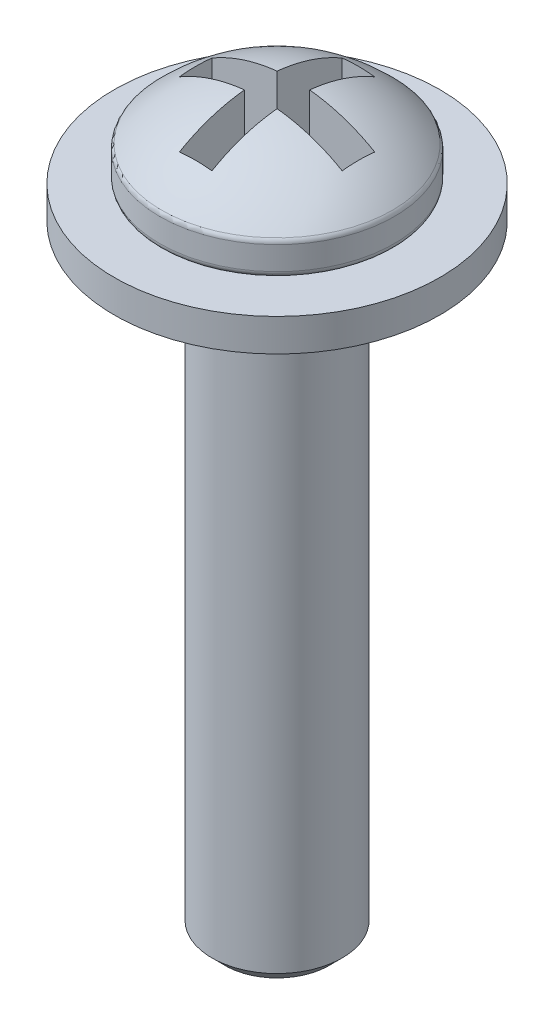
ISO-10303-21;
HEADER;
FILE_DESCRIPTION(('STEP AP214'),'2;1');
FILE_NAME('part.step','',(''),(''),'','','');
FILE_SCHEMA(('AUTOMOTIVE_DESIGN { 1 0 10303 214 1 1 1 1 }'));
ENDSEC;
DATA;
#1=APPLICATION_CONTEXT('core data for automotive mechanical design processes');
#2=APPLICATION_PROTOCOL_DEFINITION('international standard','automotive_design',2000,#1);
#3=PRODUCT_CONTEXT('',#1,'mechanical');
#4=PRODUCT('Part','Part','',(#3));
#5=PRODUCT_RELATED_PRODUCT_CATEGORY('part','',(#4));
#6=PRODUCT_DEFINITION_FORMATION('','',#4);
#7=PRODUCT_DEFINITION_CONTEXT('part definition',#1,'design');
#8=PRODUCT_DEFINITION('design','',#6,#7);
#9=PRODUCT_DEFINITION_SHAPE('','',#8);
#10=(LENGTH_UNIT() NAMED_UNIT(*) SI_UNIT(.MILLI.,.METRE.));
#11=(NAMED_UNIT(*) PLANE_ANGLE_UNIT() SI_UNIT($,.RADIAN.));
#12=(NAMED_UNIT(*) SI_UNIT($,.STERADIAN.) SOLID_ANGLE_UNIT());
#13=UNCERTAINTY_MEASURE_WITH_UNIT(LENGTH_MEASURE(1.E-05),#10,'distance_accuracy_value','');
#14=(GEOMETRIC_REPRESENTATION_CONTEXT(3) GLOBAL_UNCERTAINTY_ASSIGNED_CONTEXT((#13)) GLOBAL_UNIT_ASSIGNED_CONTEXT((#10,
#11,#12)) REPRESENTATION_CONTEXT('',''));
#15=CARTESIAN_POINT('',(0.,0.,0.));
#16=DIRECTION('',(0.,0.,1.));
#17=DIRECTION('',(1.,0.,0.));
#18=AXIS2_PLACEMENT_3D('',#15,#16,#17);
#19=CARTESIAN_POINT('',(0.,-1.2188961038961,0.));
#20=DIRECTION('',(0.,-1.,0.));
#21=DIRECTION('',(1.,0.,0.));
#22=AXIS2_PLACEMENT_3D('',#19,#20,#21);
#23=SPHERICAL_SURFACE('',#22,2.4888961038961);
#24=CARTESIAN_POINT('',(0.,0.529699603001643,0.));
#25=DIRECTION('',(0.,-1.,0.));
#26=DIRECTION('',(0.,0.,-1.));
#27=AXIS2_PLACEMENT_3D('',#24,#25,#26);
#28=CIRCLE('',#27,1.77116257576993);
#29=CARTESIAN_POINT('',(0.,0.529699603001643,-1.77116257576993));
#30=VERTEX_POINT('',#29);
#31=EDGE_CURVE('E187',#30,#30,#28,.F.);
#32=ORIENTED_EDGE('',*,*,#31,.T.);
#33=EDGE_LOOP('',(#32));
#34=FACE_BOUND('',#33,.T.);
#35=CARTESIAN_POINT('',(0.25,-1.2188961038961,0.));
#36=DIRECTION('',(-1.,0.,0.));
#37=DIRECTION('',(0.,0.,1.));
#38=AXIS2_PLACEMENT_3D('',#35,#36,#37);
#39=CIRCLE('',#38,2.47630850581853);
#40=CARTESIAN_POINT('',(0.25,1.24476049067815,-0.25));
#41=VERTEX_POINT('',#40);
#42=CARTESIAN_POINT('',(0.25,0.918767063206985,-1.25));
#43=VERTEX_POINT('',#42);
#44=EDGE_CURVE('E113',#41,#43,#39,.T.);
#45=ORIENTED_EDGE('',*,*,#44,.F.);
#46=CARTESIAN_POINT('',(0.,-1.2188961038961,-0.25));
#47=DIRECTION('',(0.,0.,-1.));
#48=DIRECTION('',(-1.,0.,0.));
#49=AXIS2_PLACEMENT_3D('',#46,#47,#48);
#50=CIRCLE('',#49,2.47630850581853);
#51=CARTESIAN_POINT('',(1.25,0.918767063206984,-0.25));
#52=VERTEX_POINT('',#51);
#53=EDGE_CURVE('E192',#41,#52,#50,.T.);
#54=ORIENTED_EDGE('',*,*,#53,.T.);
#55=CARTESIAN_POINT('',(1.25,-1.2188961038961,0.));
#56=DIRECTION('',(1.,0.,0.));
#57=DIRECTION('',(0.,0.,-1.));
#58=AXIS2_PLACEMENT_3D('',#55,#56,#57);
#59=CIRCLE('',#58,2.15223228671749);
#60=CARTESIAN_POINT('',(1.25,0.918767063206985,0.25));
#61=VERTEX_POINT('',#60);
#62=EDGE_CURVE('E193',#52,#61,#59,.T.);
#63=ORIENTED_EDGE('',*,*,#62,.T.);
#64=CARTESIAN_POINT('',(0.,-1.2188961038961,0.25));
#65=DIRECTION('',(0.,0.,1.));
#66=DIRECTION('',(1.,0.,0.));
#67=AXIS2_PLACEMENT_3D('',#64,#65,#66);
#68=CIRCLE('',#67,2.47630850581853);
#69=CARTESIAN_POINT('',(0.25,1.24476049067815,0.25));
#70=VERTEX_POINT('',#69);
#71=EDGE_CURVE('E200',#61,#70,#68,.T.);
#72=ORIENTED_EDGE('',*,*,#71,.T.);
#73=CARTESIAN_POINT('',(0.25,0.918767063206985,1.25));
#74=VERTEX_POINT('',#73);
#75=EDGE_CURVE('E152',#74,#70,#39,.T.);
#76=ORIENTED_EDGE('',*,*,#75,.F.);
#77=CARTESIAN_POINT('',(0.,-1.2188961038961,1.25));
#78=DIRECTION('',(0.,0.,-1.));
#79=DIRECTION('',(-1.,0.,0.));
#80=AXIS2_PLACEMENT_3D('',#77,#78,#79);
#81=CIRCLE('',#80,2.15223228671749);
#82=CARTESIAN_POINT('',(-0.25,0.918767063206985,1.25));
#83=VERTEX_POINT('',#82);
#84=EDGE_CURVE('E202',#83,#74,#81,.T.);
#85=ORIENTED_EDGE('',*,*,#84,.F.);
#86=CARTESIAN_POINT('',(-0.25,-1.2188961038961,0.));
#87=DIRECTION('',(1.,0.,0.));
#88=DIRECTION('',(0.,0.,-1.));
#89=AXIS2_PLACEMENT_3D('',#86,#87,#88);
#90=CIRCLE('',#89,2.47630850581853);
#91=CARTESIAN_POINT('',(-0.25,1.24476049067815,0.25));
#92=VERTEX_POINT('',#91);
#93=EDGE_CURVE('E146',#92,#83,#90,.T.);
#94=ORIENTED_EDGE('',*,*,#93,.F.);
#95=CARTESIAN_POINT('',(-1.25,0.918767063206985,0.25));
#96=VERTEX_POINT('',#95);
#97=EDGE_CURVE('E196',#92,#96,#68,.T.);
#98=ORIENTED_EDGE('',*,*,#97,.T.);
#99=CARTESIAN_POINT('',(-1.25,-1.2188961038961,0.));
#100=DIRECTION('',(-1.,0.,0.));
#101=DIRECTION('',(0.,0.,1.));
#102=AXIS2_PLACEMENT_3D('',#99,#100,#101);
#103=CIRCLE('',#102,2.15223228671749);
#104=CARTESIAN_POINT('',(-1.25,0.918767063206985,-0.25));
#105=VERTEX_POINT('',#104);
#106=EDGE_CURVE('E205',#96,#105,#103,.T.);
#107=ORIENTED_EDGE('',*,*,#106,.T.);
#108=CARTESIAN_POINT('',(-0.25,1.24476049067815,-0.25));
#109=VERTEX_POINT('',#108);
#110=EDGE_CURVE('E195',#105,#109,#50,.T.);
#111=ORIENTED_EDGE('',*,*,#110,.T.);
#112=CARTESIAN_POINT('',(-0.25,0.918767063206985,-1.25));
#113=VERTEX_POINT('',#112);
#114=EDGE_CURVE('E144',#113,#109,#90,.T.);
#115=ORIENTED_EDGE('',*,*,#114,.F.);
#116=CARTESIAN_POINT('',(0.,-1.2188961038961,-1.25));
#117=DIRECTION('',(0.,0.,1.));
#118=DIRECTION('',(1.,0.,0.));
#119=AXIS2_PLACEMENT_3D('',#116,#117,#118);
#120=CIRCLE('',#119,2.15223228671749);
#121=EDGE_CURVE('E210',#43,#113,#120,.T.);
#122=ORIENTED_EDGE('',*,*,#121,.F.);
#123=EDGE_LOOP('',(#45,#54,#63,#72,#76,#85,#94,#98,#107,#111,#115,#122));
#124=FACE_BOUND('',#123,.T.);
#125=ADVANCED_FACE('F17',(#34,#124),#23,.T.);
#126=CARTESIAN_POINT('',(1.25,5.1,0.25));
#127=DIRECTION('',(0.,0.,1.));
#128=DIRECTION('',(1.,0.,0.));
#129=AXIS2_PLACEMENT_3D('',#126,#127,#128);
#130=PLANE('',#129);
#131=DIRECTION('',(0.,-1.,0.));
#132=VECTOR('',#131,1.);
#133=CARTESIAN_POINT('',(0.25,5.1,0.25));
#134=LINE('',#133,#132);
#135=CARTESIAN_POINT('',(0.25,0.1,0.25));
#136=VERTEX_POINT('',#135);
#137=EDGE_CURVE('E153',#70,#136,#134,.T.);
#138=ORIENTED_EDGE('',*,*,#137,.F.);
#139=ORIENTED_EDGE('',*,*,#71,.F.);
#140=DIRECTION('',(0.,-1.,0.));
#141=VECTOR('',#140,1.);
#142=CARTESIAN_POINT('',(1.25,5.1,0.25));
#143=LINE('',#142,#141);
#144=CARTESIAN_POINT('',(1.25,0.1,0.25));
#145=VERTEX_POINT('',#144);
#146=EDGE_CURVE('E173',#61,#145,#143,.T.);
#147=ORIENTED_EDGE('',*,*,#146,.T.);
#148=DIRECTION('',(-1.,0.,0.));
#149=VECTOR('',#148,1.);
#150=CARTESIAN_POINT('',(1.25,0.1,0.25));
#151=LINE('',#150,#149);
#152=EDGE_CURVE('E167',#145,#136,#151,.T.);
#153=ORIENTED_EDGE('',*,*,#152,.T.);
#154=EDGE_LOOP('',(#138,#139,#147,#153));
#155=FACE_BOUND('',#154,.T.);
#156=ADVANCED_FACE('F228',(#155),#130,.F.);
#157=DIRECTION('',(0.,1.,0.));
#158=VECTOR('',#157,1.);
#159=CARTESIAN_POINT('',(-0.25,5.1,0.25));
#160=LINE('',#159,#158);
#161=CARTESIAN_POINT('',(-0.25,0.1,0.25));
#162=VERTEX_POINT('',#161);
#163=EDGE_CURVE('E150',#162,#92,#160,.T.);
#164=ORIENTED_EDGE('',*,*,#163,.F.);
#165=CARTESIAN_POINT('',(-1.25,0.1,0.25));
#166=VERTEX_POINT('',#165);
#167=EDGE_CURVE('E164',#162,#166,#151,.T.);
#168=ORIENTED_EDGE('',*,*,#167,.T.);
#169=DIRECTION('',(0.,-1.,0.));
#170=VECTOR('',#169,1.);
#171=CARTESIAN_POINT('',(-1.25,5.1,0.25));
#172=LINE('',#171,#170);
#173=EDGE_CURVE('E168',#96,#166,#172,.T.);
#174=ORIENTED_EDGE('',*,*,#173,.F.);
#175=ORIENTED_EDGE('',*,*,#97,.F.);
#176=EDGE_LOOP('',(#164,#168,#174,#175));
#177=FACE_BOUND('',#176,.T.);
#178=ADVANCED_FACE('F240',(#177),#130,.F.);
#179=CARTESIAN_POINT('',(1.25,5.1,-0.25));
#180=DIRECTION('',(0.,0.,-1.));
#181=DIRECTION('',(-1.,0.,0.));
#182=AXIS2_PLACEMENT_3D('',#179,#180,#181);
#183=PLANE('',#182);
#184=DIRECTION('',(0.,1.,0.));
#185=VECTOR('',#184,1.);
#186=CARTESIAN_POINT('',(0.25,5.1,-0.25));
#187=LINE('',#186,#185);
#188=CARTESIAN_POINT('',(0.25,0.1,-0.25));
#189=VERTEX_POINT('',#188);
#190=EDGE_CURVE('E147',#189,#41,#187,.T.);
#191=ORIENTED_EDGE('',*,*,#190,.F.);
#192=DIRECTION('',(1.,0.,0.));
#193=VECTOR('',#192,1.);
#194=CARTESIAN_POINT('',(1.25,0.1,-0.25));
#195=LINE('',#194,#193);
#196=CARTESIAN_POINT('',(1.25,0.1,-0.25));
#197=VERTEX_POINT('',#196);
#198=EDGE_CURVE('E126',#189,#197,#195,.T.);
#199=ORIENTED_EDGE('',*,*,#198,.T.);
#200=DIRECTION('',(0.,-1.,0.));
#201=VECTOR('',#200,1.);
#202=CARTESIAN_POINT('',(1.25,5.1,-0.25));
#203=LINE('',#202,#201);
#204=EDGE_CURVE('E179',#52,#197,#203,.T.);
#205=ORIENTED_EDGE('',*,*,#204,.F.);
#206=ORIENTED_EDGE('',*,*,#53,.F.);
#207=EDGE_LOOP('',(#191,#199,#205,#206));
#208=FACE_BOUND('',#207,.T.);
#209=ADVANCED_FACE('F268',(#208),#183,.F.);
#210=DIRECTION('',(0.,-1.,0.));
#211=VECTOR('',#210,1.);
#212=CARTESIAN_POINT('',(-0.25,5.1,-0.25));
#213=LINE('',#212,#211);
#214=CARTESIAN_POINT('',(-0.25,0.1,-0.25));
#215=VERTEX_POINT('',#214);
#216=EDGE_CURVE('E118',#109,#215,#213,.T.);
#217=ORIENTED_EDGE('',*,*,#216,.F.);
#218=ORIENTED_EDGE('',*,*,#110,.F.);
#219=DIRECTION('',(0.,-1.,0.));
#220=VECTOR('',#219,1.);
#221=CARTESIAN_POINT('',(-1.25,5.1,-0.25));
#222=LINE('',#221,#220);
#223=CARTESIAN_POINT('',(-1.25,0.1,-0.25));
#224=VERTEX_POINT('',#223);
#225=EDGE_CURVE('E166',#105,#224,#222,.T.);
#226=ORIENTED_EDGE('',*,*,#225,.T.);
#227=EDGE_CURVE('E157',#224,#215,#195,.T.);
#228=ORIENTED_EDGE('',*,*,#227,.T.);
#229=EDGE_LOOP('',(#217,#218,#226,#228));
#230=FACE_BOUND('',#229,.T.);
#231=ADVANCED_FACE('F265',(#230),#183,.F.);
#232=CARTESIAN_POINT('',(0.,0.,0.));
#233=DIRECTION('',(0.,-1.,0.));
#234=DIRECTION('',(0.,0.,-1.));
#235=AXIS2_PLACEMENT_3D('',#232,#233,#234);
#236=CYLINDRICAL_SURFACE('',#235,1.8);
#237=CARTESIAN_POINT('',(0.,0.1,0.));
#238=DIRECTION('',(0.,1.,0.));
#239=DIRECTION('',(0.,0.,1.));
#240=AXIS2_PLACEMENT_3D('',#237,#238,#239);
#241=CIRCLE('',#240,1.8);
#242=CARTESIAN_POINT('',(0.,0.1,1.8));
#243=VERTEX_POINT('',#242);
#244=EDGE_CURVE('E184',#243,#243,#241,.T.);
#245=ORIENTED_EDGE('',*,*,#244,.T.);
#246=EDGE_LOOP('',(#245));
#247=FACE_BOUND('',#246,.T.);
#248=CARTESIAN_POINT('',(0.,0.459443729156185,0.));
#249=DIRECTION('',(0.,-1.,0.));
#250=DIRECTION('',(0.,0.,-1.));
#251=AXIS2_PLACEMENT_3D('',#248,#249,#250);
#252=CIRCLE('',#251,1.8);
#253=CARTESIAN_POINT('',(0.,0.459443729156185,-1.8));
#254=VERTEX_POINT('',#253);
#255=EDGE_CURVE('E181',#254,#254,#252,.T.);
#256=ORIENTED_EDGE('',*,*,#255,.T.);
#257=EDGE_LOOP('',(#256));
#258=FACE_BOUND('',#257,.T.);
#259=ADVANCED_FACE('F245',(#247,#258),#236,.T.);
#260=CARTESIAN_POINT('',(0.,0.1,0.));
#261=DIRECTION('',(0.,1.,0.));
#262=DIRECTION('',(0.,0.,1.));
#263=AXIS2_PLACEMENT_3D('',#260,#261,#262);
#264=TOROIDAL_SURFACE('',#263,1.7,0.1);
#265=ORIENTED_EDGE('',*,*,#244,.F.);
#266=EDGE_LOOP('',(#265));
#267=FACE_BOUND('',#266,.T.);
#268=CARTESIAN_POINT('',(0.,0.,0.));
#269=DIRECTION('',(0.,1.,0.));
#270=DIRECTION('',(0.,0.,1.));
#271=AXIS2_PLACEMENT_3D('',#268,#269,#270);
#272=CIRCLE('',#271,1.7);
#273=CARTESIAN_POINT('',(0.,0.,1.7));
#274=VERTEX_POINT('',#273);
#275=EDGE_CURVE('E174',#274,#274,#272,.F.);
#276=ORIENTED_EDGE('',*,*,#275,.F.);
#277=EDGE_LOOP('',(#276));
#278=FACE_BOUND('',#277,.T.);
#279=ADVANCED_FACE('F242',(#267,#278),#264,.T.);
#280=CARTESIAN_POINT('',(0.,0.459443729156185,0.));
#281=DIRECTION('',(0.,-1.,0.));
#282=DIRECTION('',(0.,0.,-1.));
#283=AXIS2_PLACEMENT_3D('',#280,#281,#282);
#284=TOROIDAL_SURFACE('',#283,1.7,0.1);
#285=ORIENTED_EDGE('',*,*,#31,.F.);
#286=EDGE_LOOP('',(#285));
#287=FACE_BOUND('',#286,.T.);
#288=ORIENTED_EDGE('',*,*,#255,.F.);
#289=EDGE_LOOP('',(#288));
#290=FACE_BOUND('',#289,.T.);
#291=ADVANCED_FACE('F244',(#287,#290),#284,.T.);
#292=CARTESIAN_POINT('',(-1.25,5.1,0.25));
#293=DIRECTION('',(-1.,0.,0.));
#294=DIRECTION('',(0.,0.,1.));
#295=AXIS2_PLACEMENT_3D('',#292,#293,#294);
#296=PLANE('',#295);
#297=ORIENTED_EDGE('',*,*,#173,.T.);
#298=DIRECTION('',(0.,0.,-1.));
#299=VECTOR('',#298,1.);
#300=CARTESIAN_POINT('',(-1.25,0.1,0.25));
#301=LINE('',#300,#299);
#302=EDGE_CURVE('E156',#166,#224,#301,.T.);
#303=ORIENTED_EDGE('',*,*,#302,.T.);
#304=ORIENTED_EDGE('',*,*,#225,.F.);
#305=ORIENTED_EDGE('',*,*,#106,.F.);
#306=EDGE_LOOP('',(#297,#303,#304,#305));
#307=FACE_BOUND('',#306,.T.);
#308=ADVANCED_FACE('F249',(#307),#296,.F.);
#309=CARTESIAN_POINT('',(1.25,5.1,0.25));
#310=DIRECTION('',(1.,0.,0.));
#311=DIRECTION('',(0.,0.,-1.));
#312=AXIS2_PLACEMENT_3D('',#309,#310,#311);
#313=PLANE('',#312);
#314=ORIENTED_EDGE('',*,*,#204,.T.);
#315=DIRECTION('',(0.,0.,1.));
#316=VECTOR('',#315,1.);
#317=CARTESIAN_POINT('',(1.25,0.1,0.25));
#318=LINE('',#317,#316);
#319=EDGE_CURVE('E165',#197,#145,#318,.T.);
#320=ORIENTED_EDGE('',*,*,#319,.T.);
#321=ORIENTED_EDGE('',*,*,#146,.F.);
#322=ORIENTED_EDGE('',*,*,#62,.F.);
#323=EDGE_LOOP('',(#314,#320,#321,#322));
#324=FACE_BOUND('',#323,.T.);
#325=ADVANCED_FACE('F255',(#324),#313,.F.);
#326=CARTESIAN_POINT('',(0.,0.1,0.));
#327=DIRECTION('',(0.,1.,0.));
#328=DIRECTION('',(0.,0.,1.));
#329=AXIS2_PLACEMENT_3D('',#326,#327,#328);
#330=PLANE('',#329);
#331=ORIENTED_EDGE('',*,*,#167,.F.);
#332=DIRECTION('',(0.,0.,1.));
#333=VECTOR('',#332,1.);
#334=CARTESIAN_POINT('',(-0.25,0.1,1.25));
#335=LINE('',#334,#333);
#336=CARTESIAN_POINT('',(-0.25,0.1,1.25));
#337=VERTEX_POINT('',#336);
#338=EDGE_CURVE('E131',#162,#337,#335,.T.);
#339=ORIENTED_EDGE('',*,*,#338,.T.);
#340=DIRECTION('',(1.,0.,0.));
#341=VECTOR('',#340,1.);
#342=CARTESIAN_POINT('',(-0.25,0.1,1.25));
#343=LINE('',#342,#341);
#344=CARTESIAN_POINT('',(0.25,0.1,1.25));
#345=VERTEX_POINT('',#344);
#346=EDGE_CURVE('E140',#337,#345,#343,.T.);
#347=ORIENTED_EDGE('',*,*,#346,.T.);
#348=DIRECTION('',(0.,0.,-1.));
#349=VECTOR('',#348,1.);
#350=CARTESIAN_POINT('',(0.25,0.1,1.25));
#351=LINE('',#350,#349);
#352=EDGE_CURVE('E37',#345,#136,#351,.T.);
#353=ORIENTED_EDGE('',*,*,#352,.T.);
#354=ORIENTED_EDGE('',*,*,#152,.F.);
#355=ORIENTED_EDGE('',*,*,#319,.F.);
#356=ORIENTED_EDGE('',*,*,#198,.F.);
#357=CARTESIAN_POINT('',(0.25,0.1,-1.25));
#358=VERTEX_POINT('',#357);
#359=EDGE_CURVE('E115',#189,#358,#351,.T.);
#360=ORIENTED_EDGE('',*,*,#359,.T.);
#361=DIRECTION('',(-1.,0.,0.));
#362=VECTOR('',#361,1.);
#363=CARTESIAN_POINT('',(-0.25,0.1,-1.25));
#364=LINE('',#363,#362);
#365=CARTESIAN_POINT('',(-0.25,0.1,-1.25));
#366=VERTEX_POINT('',#365);
#367=EDGE_CURVE('E122',#358,#366,#364,.T.);
#368=ORIENTED_EDGE('',*,*,#367,.T.);
#369=EDGE_CURVE('E31',#366,#215,#335,.T.);
#370=ORIENTED_EDGE('',*,*,#369,.T.);
#371=ORIENTED_EDGE('',*,*,#227,.F.);
#372=ORIENTED_EDGE('',*,*,#302,.F.);
#373=EDGE_LOOP('',(#331,#339,#347,#353,#354,#355,#356,#360,#368,#370,#371,#372));
#374=FACE_BOUND('',#373,.T.);
#375=ADVANCED_FACE('F123',(#374),#330,.T.);
#376=CARTESIAN_POINT('',(-0.25,1.25741240192243,1.25));
#377=DIRECTION('',(1.,0.,0.));
#378=DIRECTION('',(0.,0.,-1.));
#379=AXIS2_PLACEMENT_3D('',#376,#377,#378);
#380=PLANE('',#379);
#381=ORIENTED_EDGE('',*,*,#114,.T.);
#382=ORIENTED_EDGE('',*,*,#216,.T.);
#383=ORIENTED_EDGE('',*,*,#369,.F.);
#384=DIRECTION('',(0.,-1.,0.));
#385=VECTOR('',#384,1.);
#386=CARTESIAN_POINT('',(-0.25,1.25741240192243,-1.25));
#387=LINE('',#386,#385);
#388=EDGE_CURVE('E120',#113,#366,#387,.T.);
#389=ORIENTED_EDGE('',*,*,#388,.F.);
#390=EDGE_LOOP('',(#381,#382,#383,#389));
#391=FACE_BOUND('',#390,.T.);
#392=ADVANCED_FACE('F313',(#391),#380,.T.);
#393=CARTESIAN_POINT('',(0.25,1.25741240192243,1.25));
#394=DIRECTION('',(-1.,0.,0.));
#395=DIRECTION('',(0.,0.,1.));
#396=AXIS2_PLACEMENT_3D('',#393,#394,#395);
#397=PLANE('',#396);
#398=ORIENTED_EDGE('',*,*,#44,.T.);
#399=DIRECTION('',(0.,-1.,0.));
#400=VECTOR('',#399,1.);
#401=CARTESIAN_POINT('',(0.25,1.25741240192243,-1.25));
#402=LINE('',#401,#400);
#403=EDGE_CURVE('E108',#43,#358,#402,.T.);
#404=ORIENTED_EDGE('',*,*,#403,.T.);
#405=ORIENTED_EDGE('',*,*,#359,.F.);
#406=ORIENTED_EDGE('',*,*,#190,.T.);
#407=EDGE_LOOP('',(#398,#404,#405,#406));
#408=FACE_BOUND('',#407,.T.);
#409=ADVANCED_FACE('F112',(#408),#397,.T.);
#410=CARTESIAN_POINT('',(-0.25,1.25741240192243,-1.25));
#411=DIRECTION('',(0.,0.,1.));
#412=DIRECTION('',(1.,0.,0.));
#413=AXIS2_PLACEMENT_3D('',#410,#411,#412);
#414=PLANE('',#413);
#415=ORIENTED_EDGE('',*,*,#121,.T.);
#416=ORIENTED_EDGE('',*,*,#388,.T.);
#417=ORIENTED_EDGE('',*,*,#367,.F.);
#418=ORIENTED_EDGE('',*,*,#403,.F.);
#419=EDGE_LOOP('',(#415,#416,#417,#418));
#420=FACE_BOUND('',#419,.T.);
#421=ADVANCED_FACE('F127',(#420),#414,.T.);
#422=CARTESIAN_POINT('',(-0.25,1.25741240192243,1.25));
#423=DIRECTION('',(0.,0.,-1.));
#424=DIRECTION('',(-1.,0.,0.));
#425=AXIS2_PLACEMENT_3D('',#422,#423,#424);
#426=PLANE('',#425);
#427=ORIENTED_EDGE('',*,*,#84,.T.);
#428=DIRECTION('',(0.,-1.,0.));
#429=VECTOR('',#428,1.);
#430=CARTESIAN_POINT('',(0.25,1.25741240192243,1.25));
#431=LINE('',#430,#429);
#432=EDGE_CURVE('E136',#74,#345,#431,.T.);
#433=ORIENTED_EDGE('',*,*,#432,.T.);
#434=ORIENTED_EDGE('',*,*,#346,.F.);
#435=DIRECTION('',(0.,-1.,0.));
#436=VECTOR('',#435,1.);
#437=CARTESIAN_POINT('',(-0.25,1.25741240192243,1.25));
#438=LINE('',#437,#436);
#439=EDGE_CURVE('E143',#83,#337,#438,.T.);
#440=ORIENTED_EDGE('',*,*,#439,.F.);
#441=EDGE_LOOP('',(#427,#433,#434,#440));
#442=FACE_BOUND('',#441,.T.);
#443=ADVANCED_FACE('F304',(#442),#426,.T.);
#444=ORIENTED_EDGE('',*,*,#75,.T.);
#445=ORIENTED_EDGE('',*,*,#137,.T.);
#446=ORIENTED_EDGE('',*,*,#352,.F.);
#447=ORIENTED_EDGE('',*,*,#432,.F.);
#448=EDGE_LOOP('',(#444,#445,#446,#447));
#449=FACE_BOUND('',#448,.T.);
#450=ADVANCED_FACE('F308',(#449),#397,.T.);
#451=ORIENTED_EDGE('',*,*,#93,.T.);
#452=ORIENTED_EDGE('',*,*,#439,.T.);
#453=ORIENTED_EDGE('',*,*,#338,.F.);
#454=ORIENTED_EDGE('',*,*,#163,.T.);
#455=EDGE_LOOP('',(#451,#452,#453,#454));
#456=FACE_BOUND('',#455,.T.);
#457=ADVANCED_FACE('F298',(#456),#380,.T.);
#458=CARTESIAN_POINT('',(0.,-0.5,0.));
#459=DIRECTION('',(0.,1.,0.));
#460=DIRECTION('',(0.,0.,1.));
#461=AXIS2_PLACEMENT_3D('',#458,#459,#460);
#462=CYLINDRICAL_SURFACE('',#461,2.5);
#463=CARTESIAN_POINT('',(0.,-0.5,0.));
#464=DIRECTION('',(0.,-1.,0.));
#465=DIRECTION('',(0.,0.,-1.));
#466=AXIS2_PLACEMENT_3D('',#463,#464,#465);
#467=CIRCLE('',#466,2.5);
#468=CARTESIAN_POINT('',(0.,-0.5,-2.5));
#469=VERTEX_POINT('',#468);
#470=EDGE_CURVE('E284',#469,#469,#467,.T.);
#471=ORIENTED_EDGE('',*,*,#470,.F.);
#472=EDGE_LOOP('',(#471));
#473=FACE_BOUND('',#472,.T.);
#474=CARTESIAN_POINT('',(0.,0.,0.));
#475=DIRECTION('',(0.,-1.,0.));
#476=DIRECTION('',(0.,0.,-1.));
#477=AXIS2_PLACEMENT_3D('',#474,#475,#476);
#478=CIRCLE('',#477,2.5);
#479=CARTESIAN_POINT('',(0.,0.,-2.5));
#480=VERTEX_POINT('',#479);
#481=EDGE_CURVE('E281',#480,#480,#478,.T.);
#482=ORIENTED_EDGE('',*,*,#481,.T.);
#483=EDGE_LOOP('',(#482));
#484=FACE_BOUND('',#483,.T.);
#485=ADVANCED_FACE('F293',(#473,#484),#462,.T.);
#486=CARTESIAN_POINT('',(0.,-0.5,0.));
#487=DIRECTION('',(0.,-1.,0.));
#488=DIRECTION('',(0.,0.,-1.));
#489=AXIS2_PLACEMENT_3D('',#486,#487,#488);
#490=PLANE('',#489);
#491=CARTESIAN_POINT('',(0.,-0.5,0.));
#492=DIRECTION('',(0.,-1.,0.));
#493=DIRECTION('',(0.,0.,-1.));
#494=AXIS2_PLACEMENT_3D('',#491,#492,#493);
#495=CIRCLE('',#494,1.);
#496=CARTESIAN_POINT('',(0.,-0.5,-1.));
#497=VERTEX_POINT('',#496);
#498=EDGE_CURVE('E21',#497,#497,#495,.T.);
#499=ORIENTED_EDGE('',*,*,#498,.F.);
#500=EDGE_LOOP('',(#499));
#501=FACE_BOUND('',#500,.T.);
#502=ORIENTED_EDGE('',*,*,#470,.T.);
#503=EDGE_LOOP('',(#502));
#504=FACE_BOUND('',#503,.T.);
#505=ADVANCED_FACE('F280',(#501,#504),#490,.T.);
#506=CARTESIAN_POINT('',(0.,0.,0.));
#507=DIRECTION('',(0.,-1.,0.));
#508=DIRECTION('',(0.,0.,-1.));
#509=AXIS2_PLACEMENT_3D('',#506,#507,#508);
#510=PLANE('',#509);
#511=ORIENTED_EDGE('',*,*,#275,.T.);
#512=EDGE_LOOP('',(#511));
#513=FACE_BOUND('',#512,.T.);
#514=ORIENTED_EDGE('',*,*,#481,.F.);
#515=EDGE_LOOP('',(#514));
#516=FACE_BOUND('',#515,.T.);
#517=ADVANCED_FACE('F223',(#513,#516),#510,.F.);
#518=CARTESIAN_POINT('',(0.,-10.,0.));
#519=DIRECTION('',(0.,-1.,0.));
#520=DIRECTION('',(0.,0.,-1.));
#521=AXIS2_PLACEMENT_3D('',#518,#519,#520);
#522=PLANE('',#521);
#523=CARTESIAN_POINT('',(0.,-10.,0.));
#524=DIRECTION('',(0.,-1.,0.));
#525=DIRECTION('',(0.,0.,-1.));
#526=AXIS2_PLACEMENT_3D('',#523,#524,#525);
#527=CIRCLE('',#526,0.8);
#528=CARTESIAN_POINT('',(0.,-10.,-0.8));
#529=VERTEX_POINT('',#528);
#530=EDGE_CURVE('E27',#529,#529,#527,.T.);
#531=ORIENTED_EDGE('',*,*,#530,.T.);
#532=EDGE_LOOP('',(#531));
#533=FACE_BOUND('',#532,.T.);
#534=ADVANCED_FACE('F215',(#533),#522,.T.);
#535=CARTESIAN_POINT('',(0.,-10.,0.));
#536=DIRECTION('',(0.,1.,0.));
#537=DIRECTION('',(0.,0.,1.));
#538=AXIS2_PLACEMENT_3D('',#535,#536,#537);
#539=CONICAL_SURFACE('',#538,0.8,0.78539816339745);
#540=CARTESIAN_POINT('',(0.,-9.8,0.));
#541=DIRECTION('',(0.,-1.,0.));
#542=DIRECTION('',(0.,0.,-1.));
#543=AXIS2_PLACEMENT_3D('',#540,#541,#542);
#544=CIRCLE('',#543,1.);
#545=CARTESIAN_POINT('',(0.,-9.8,-1.));
#546=VERTEX_POINT('',#545);
#547=EDGE_CURVE('E11',#546,#546,#544,.F.);
#548=ORIENTED_EDGE('',*,*,#547,.F.);
#549=EDGE_LOOP('',(#548));
#550=FACE_BOUND('',#549,.T.);
#551=ORIENTED_EDGE('',*,*,#530,.F.);
#552=EDGE_LOOP('',(#551));
#553=FACE_BOUND('',#552,.T.);
#554=ADVANCED_FACE('F19',(#550,#553),#539,.T.);
#555=CARTESIAN_POINT('',(0.,-10.,0.));
#556=DIRECTION('',(0.,1.,0.));
#557=DIRECTION('',(0.,0.,1.));
#558=AXIS2_PLACEMENT_3D('',#555,#556,#557);
#559=CYLINDRICAL_SURFACE('',#558,1.);
#560=ORIENTED_EDGE('',*,*,#498,.T.);
#561=EDGE_LOOP('',(#560));
#562=FACE_BOUND('',#561,.T.);
#563=ORIENTED_EDGE('',*,*,#547,.T.);
#564=EDGE_LOOP('',(#563));
#565=FACE_BOUND('',#564,.T.);
#566=ADVANCED_FACE('F214',(#562,#565),#559,.T.);
#567=CLOSED_SHELL('',(#125,#156,#178,#209,#231,#259,#279,#291,#308,#325,#375,#392,#409,#421,
#443,#450,#457,#485,#505,#517,#534,#554,#566));
#568=MANIFOLD_SOLID_BREP('B1',#567);
#569=ADVANCED_BREP_SHAPE_REPRESENTATION('',(#18,#568),#14);
#570=SHAPE_DEFINITION_REPRESENTATION(#9,#569);
ENDSEC;
END-ISO-10303-21;
